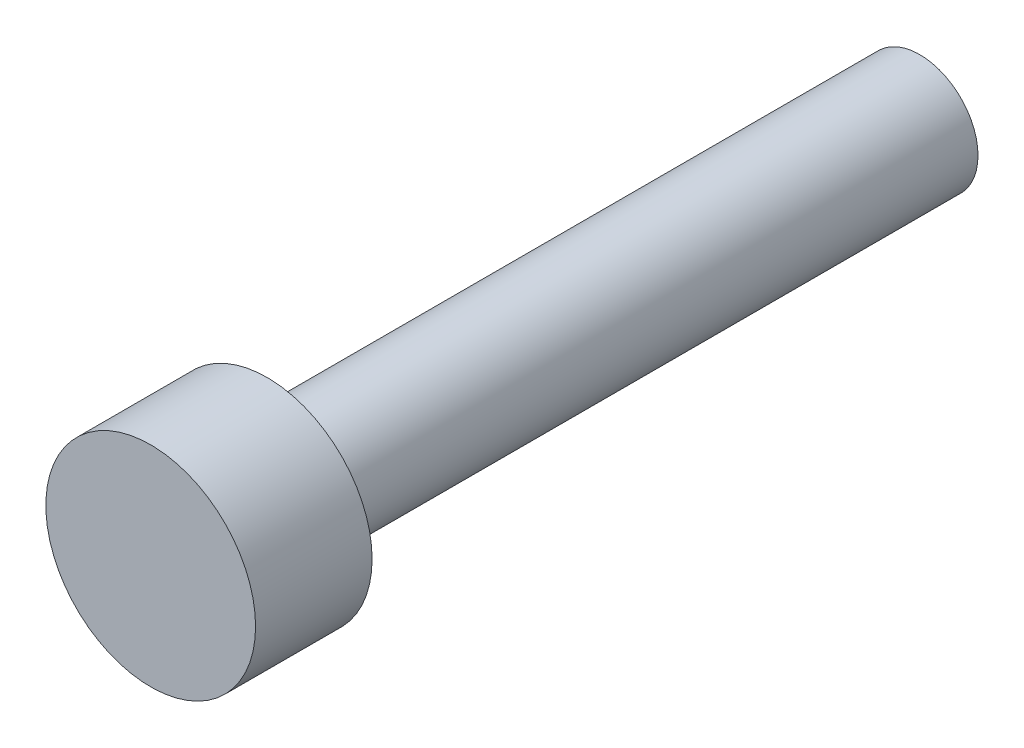
ISO-10303-21;
HEADER;
FILE_DESCRIPTION(('STEP AP214'),'2;1');
FILE_NAME('part.step','',(''),(''),'','','');
FILE_SCHEMA(('AUTOMOTIVE_DESIGN { 1 0 10303 214 1 1 1 1 }'));
ENDSEC;
DATA;
#1=APPLICATION_CONTEXT('core data for automotive mechanical design processes');
#2=APPLICATION_PROTOCOL_DEFINITION('international standard','automotive_design',2000,#1);
#3=PRODUCT_CONTEXT('',#1,'mechanical');
#4=PRODUCT('Part','Part','',(#3));
#5=PRODUCT_RELATED_PRODUCT_CATEGORY('part','',(#4));
#6=PRODUCT_DEFINITION_FORMATION('','',#4);
#7=PRODUCT_DEFINITION_CONTEXT('part definition',#1,'design');
#8=PRODUCT_DEFINITION('design','',#6,#7);
#9=PRODUCT_DEFINITION_SHAPE('','',#8);
#10=(LENGTH_UNIT() NAMED_UNIT(*) SI_UNIT(.MILLI.,.METRE.));
#11=(NAMED_UNIT(*) PLANE_ANGLE_UNIT() SI_UNIT($,.RADIAN.));
#12=(NAMED_UNIT(*) SI_UNIT($,.STERADIAN.) SOLID_ANGLE_UNIT());
#13=UNCERTAINTY_MEASURE_WITH_UNIT(LENGTH_MEASURE(1.E-05),#10,'distance_accuracy_value','');
#14=(GEOMETRIC_REPRESENTATION_CONTEXT(3) GLOBAL_UNCERTAINTY_ASSIGNED_CONTEXT((#13)) GLOBAL_UNIT_ASSIGNED_CONTEXT((#10,
#11,#12)) REPRESENTATION_CONTEXT('',''));
#15=CARTESIAN_POINT('',(0.,0.,0.));
#16=DIRECTION('',(0.,0.,1.));
#17=DIRECTION('',(1.,0.,0.));
#18=AXIS2_PLACEMENT_3D('',#15,#16,#17);
#19=CARTESIAN_POINT('',(0.,0.,0.));
#20=DIRECTION('',(0.,0.,-1.));
#21=DIRECTION('',(-1.,0.,0.));
#22=AXIS2_PLACEMENT_3D('',#19,#20,#21);
#23=CYLINDRICAL_SURFACE('',#22,1.25);
#24=CARTESIAN_POINT('',(0.,0.,0.));
#25=DIRECTION('',(0.,0.,1.));
#26=DIRECTION('',(1.,0.,0.));
#27=AXIS2_PLACEMENT_3D('',#24,#25,#26);
#28=CIRCLE('',#27,1.25);
#29=CARTESIAN_POINT('',(1.25,0.,0.));
#30=VERTEX_POINT('',#29);
#31=EDGE_CURVE('E10',#30,#30,#28,.T.);
#32=ORIENTED_EDGE('',*,*,#31,.F.);
#33=EDGE_LOOP('',(#32));
#34=FACE_BOUND('',#33,.T.);
#35=CARTESIAN_POINT('',(0.,0.,-14.));
#36=DIRECTION('',(0.,0.,1.));
#37=DIRECTION('',(1.,0.,0.));
#38=AXIS2_PLACEMENT_3D('',#35,#36,#37);
#39=CIRCLE('',#38,1.25);
#40=CARTESIAN_POINT('',(1.25,0.,-14.));
#41=VERTEX_POINT('',#40);
#42=EDGE_CURVE('E37',#41,#41,#39,.T.);
#43=ORIENTED_EDGE('',*,*,#42,.T.);
#44=EDGE_LOOP('',(#43));
#45=FACE_BOUND('',#44,.T.);
#46=ADVANCED_FACE('F40',(#34,#45),#23,.T.);
#47=CARTESIAN_POINT('',(0.,0.,-14.));
#48=DIRECTION('',(0.,0.,1.));
#49=DIRECTION('',(1.,0.,0.));
#50=AXIS2_PLACEMENT_3D('',#47,#48,#49);
#51=PLANE('',#50);
#52=ORIENTED_EDGE('',*,*,#42,.F.);
#53=EDGE_LOOP('',(#52));
#54=FACE_BOUND('',#53,.T.);
#55=ADVANCED_FACE('F58',(#54),#51,.F.);
#56=CARTESIAN_POINT('',(0.,0.,2.5));
#57=DIRECTION('',(0.,0.,-1.));
#58=DIRECTION('',(-1.,0.,0.));
#59=AXIS2_PLACEMENT_3D('',#56,#57,#58);
#60=CYLINDRICAL_SURFACE('',#59,2.25);
#61=CARTESIAN_POINT('',(0.,0.,2.5));
#62=DIRECTION('',(0.,0.,1.));
#63=DIRECTION('',(1.,0.,0.));
#64=AXIS2_PLACEMENT_3D('',#61,#62,#63);
#65=CIRCLE('',#64,2.25);
#66=CARTESIAN_POINT('',(2.25,0.,2.5));
#67=VERTEX_POINT('',#66);
#68=EDGE_CURVE('E50',#67,#67,#65,.T.);
#69=ORIENTED_EDGE('',*,*,#68,.F.);
#70=EDGE_LOOP('',(#69));
#71=FACE_BOUND('',#70,.T.);
#72=CARTESIAN_POINT('',(0.,0.,0.));
#73=DIRECTION('',(0.,0.,1.));
#74=DIRECTION('',(1.,0.,0.));
#75=AXIS2_PLACEMENT_3D('',#72,#73,#74);
#76=CIRCLE('',#75,2.25);
#77=CARTESIAN_POINT('',(2.25,0.,0.));
#78=VERTEX_POINT('',#77);
#79=EDGE_CURVE('E47',#78,#78,#76,.T.);
#80=ORIENTED_EDGE('',*,*,#79,.T.);
#81=EDGE_LOOP('',(#80));
#82=FACE_BOUND('',#81,.T.);
#83=ADVANCED_FACE('F60',(#71,#82),#60,.T.);
#84=CARTESIAN_POINT('',(0.,0.,2.5));
#85=DIRECTION('',(0.,0.,1.));
#86=DIRECTION('',(1.,0.,0.));
#87=AXIS2_PLACEMENT_3D('',#84,#85,#86);
#88=PLANE('',#87);
#89=ORIENTED_EDGE('',*,*,#68,.T.);
#90=EDGE_LOOP('',(#89));
#91=FACE_BOUND('',#90,.T.);
#92=ADVANCED_FACE('F54',(#91),#88,.T.);
#93=CARTESIAN_POINT('',(0.,0.,0.));
#94=DIRECTION('',(0.,0.,1.));
#95=DIRECTION('',(1.,0.,0.));
#96=AXIS2_PLACEMENT_3D('',#93,#94,#95);
#97=PLANE('',#96);
#98=ORIENTED_EDGE('',*,*,#31,.T.);
#99=EDGE_LOOP('',(#98));
#100=FACE_BOUND('',#99,.T.);
#101=ORIENTED_EDGE('',*,*,#79,.F.);
#102=EDGE_LOOP('',(#101));
#103=FACE_BOUND('',#102,.T.);
#104=ADVANCED_FACE('F64',(#100,#103),#97,.F.);
#105=CLOSED_SHELL('',(#46,#55,#83,#92,#104));
#106=MANIFOLD_SOLID_BREP('B2',#105);
#107=ADVANCED_BREP_SHAPE_REPRESENTATION('',(#18,#106),#14);
#108=SHAPE_DEFINITION_REPRESENTATION(#9,#107);
ENDSEC;
END-ISO-10303-21;
